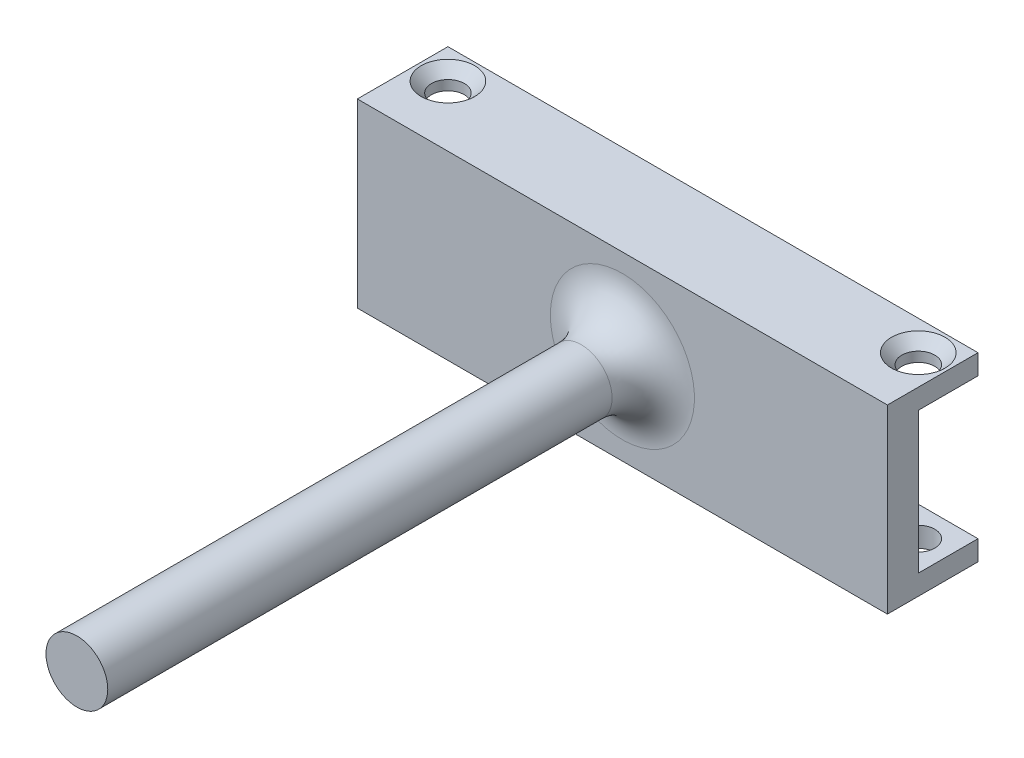
ISO-10303-21;
HEADER;
FILE_DESCRIPTION(('STEP AP214'),'2;1');
FILE_NAME('part.step','',(''),(''),'','','');
FILE_SCHEMA(('AUTOMOTIVE_DESIGN { 1 0 10303 214 1 1 1 1 }'));
ENDSEC;
DATA;
#1=APPLICATION_CONTEXT('core data for automotive mechanical design processes');
#2=APPLICATION_PROTOCOL_DEFINITION('international standard','automotive_design',2000,#1);
#3=PRODUCT_CONTEXT('',#1,'mechanical');
#4=PRODUCT('Part','Part','',(#3));
#5=PRODUCT_RELATED_PRODUCT_CATEGORY('part','',(#4));
#6=PRODUCT_DEFINITION_FORMATION('','',#4);
#7=PRODUCT_DEFINITION_CONTEXT('part definition',#1,'design');
#8=PRODUCT_DEFINITION('design','',#6,#7);
#9=PRODUCT_DEFINITION_SHAPE('','',#8);
#10=(LENGTH_UNIT() NAMED_UNIT(*) SI_UNIT(.MILLI.,.METRE.));
#11=(NAMED_UNIT(*) PLANE_ANGLE_UNIT() SI_UNIT($,.RADIAN.));
#12=(NAMED_UNIT(*) SI_UNIT($,.STERADIAN.) SOLID_ANGLE_UNIT());
#13=UNCERTAINTY_MEASURE_WITH_UNIT(LENGTH_MEASURE(1.E-05),#10,'distance_accuracy_value','');
#14=(GEOMETRIC_REPRESENTATION_CONTEXT(3) GLOBAL_UNCERTAINTY_ASSIGNED_CONTEXT((#13)) GLOBAL_UNIT_ASSIGNED_CONTEXT((#10,
#11,#12)) REPRESENTATION_CONTEXT('',''));
#15=CARTESIAN_POINT('',(0.,0.,0.));
#16=DIRECTION('',(0.,0.,1.));
#17=DIRECTION('',(1.,0.,0.));
#18=AXIS2_PLACEMENT_3D('',#15,#16,#17);
#19=CARTESIAN_POINT('',(0.,0.,0.));
#20=DIRECTION('',(0.,0.,-1.));
#21=DIRECTION('',(-1.,0.,0.));
#22=AXIS2_PLACEMENT_3D('',#19,#20,#21);
#23=PLANE('',#22);
#24=DIRECTION('',(1.,0.,0.));
#25=VECTOR('',#24,1.);
#26=CARTESIAN_POINT('',(51.5,15.65,0.));
#27=LINE('',#26,#25);
#28=CARTESIAN_POINT('',(0.,15.65,0.));
#29=VERTEX_POINT('',#28);
#30=CARTESIAN_POINT('',(51.5,15.65,0.));
#31=VERTEX_POINT('',#30);
#32=EDGE_CURVE('E131',#29,#31,#27,.T.);
#33=ORIENTED_EDGE('',*,*,#32,.F.);
#34=DIRECTION('',(0.,-1.,0.));
#35=VECTOR('',#34,1.);
#36=CARTESIAN_POINT('',(0.,0.,0.));
#37=LINE('',#36,#35);
#38=CARTESIAN_POINT('',(0.,17.6,0.));
#39=VERTEX_POINT('',#38);
#40=EDGE_CURVE('E151',#39,#29,#37,.T.);
#41=ORIENTED_EDGE('',*,*,#40,.F.);
#42=DIRECTION('',(-1.,0.,0.));
#43=VECTOR('',#42,1.);
#44=CARTESIAN_POINT('',(0.,17.6,0.));
#45=LINE('',#44,#43);
#46=CARTESIAN_POINT('',(51.5,17.6,0.));
#47=VERTEX_POINT('',#46);
#48=EDGE_CURVE('E86',#47,#39,#45,.T.);
#49=ORIENTED_EDGE('',*,*,#48,.F.);
#50=DIRECTION('',(0.,1.,0.));
#51=VECTOR('',#50,1.);
#52=CARTESIAN_POINT('',(51.5,0.,0.));
#53=LINE('',#52,#51);
#54=EDGE_CURVE('E157',#31,#47,#53,.T.);
#55=ORIENTED_EDGE('',*,*,#54,.F.);
#56=EDGE_LOOP('',(#33,#41,#49,#55));
#57=FACE_BOUND('',#56,.T.);
#58=ADVANCED_FACE('F41',(#57),#23,.T.);
#59=CARTESIAN_POINT('',(0.,0.,8.8));
#60=DIRECTION('',(1.,0.,0.));
#61=DIRECTION('',(0.,1.,0.));
#62=AXIS2_PLACEMENT_3D('',#59,#60,#61);
#63=PLANE('',#62);
#64=ORIENTED_EDGE('',*,*,#40,.T.);
#65=DIRECTION('',(0.,0.,-1.));
#66=VECTOR('',#65,1.);
#67=CARTESIAN_POINT('',(0.,15.65,5.8));
#68=LINE('',#67,#66);
#69=CARTESIAN_POINT('',(0.,15.65,5.8));
#70=VERTEX_POINT('',#69);
#71=EDGE_CURVE('E139',#70,#29,#68,.T.);
#72=ORIENTED_EDGE('',*,*,#71,.F.);
#73=DIRECTION('',(0.,1.,0.));
#74=VECTOR('',#73,1.);
#75=CARTESIAN_POINT('',(0.,1.95,5.8));
#76=LINE('',#75,#74);
#77=CARTESIAN_POINT('',(0.,1.95,5.8));
#78=VERTEX_POINT('',#77);
#79=EDGE_CURVE('E121',#78,#70,#76,.T.);
#80=ORIENTED_EDGE('',*,*,#79,.F.);
#81=DIRECTION('',(0.,0.,-1.));
#82=VECTOR('',#81,1.);
#83=CARTESIAN_POINT('',(0.,1.95,5.8));
#84=LINE('',#83,#82);
#85=CARTESIAN_POINT('',(0.,1.95,0.));
#86=VERTEX_POINT('',#85);
#87=EDGE_CURVE('E118',#78,#86,#84,.T.);
#88=ORIENTED_EDGE('',*,*,#87,.T.);
#89=CARTESIAN_POINT('',(0.,0.,0.));
#90=VERTEX_POINT('',#89);
#91=EDGE_CURVE('E155',#86,#90,#37,.T.);
#92=ORIENTED_EDGE('',*,*,#91,.T.);
#93=DIRECTION('',(0.,0.,-1.));
#94=VECTOR('',#93,1.);
#95=CARTESIAN_POINT('',(0.,0.,8.8));
#96=LINE('',#95,#94);
#97=CARTESIAN_POINT('',(0.,0.,8.8));
#98=VERTEX_POINT('',#97);
#99=EDGE_CURVE('E165',#98,#90,#96,.T.);
#100=ORIENTED_EDGE('',*,*,#99,.F.);
#101=DIRECTION('',(0.,-1.,0.));
#102=VECTOR('',#101,1.);
#103=CARTESIAN_POINT('',(0.,0.,8.8));
#104=LINE('',#103,#102);
#105=CARTESIAN_POINT('',(0.,17.6,8.8));
#106=VERTEX_POINT('',#105);
#107=EDGE_CURVE('E144',#106,#98,#104,.T.);
#108=ORIENTED_EDGE('',*,*,#107,.F.);
#109=DIRECTION('',(0.,0.,-1.));
#110=VECTOR('',#109,1.);
#111=CARTESIAN_POINT('',(0.,17.6,8.8));
#112=LINE('',#111,#110);
#113=EDGE_CURVE('E150',#106,#39,#112,.T.);
#114=ORIENTED_EDGE('',*,*,#113,.T.);
#115=EDGE_LOOP('',(#64,#72,#80,#88,#92,#100,#108,#114));
#116=FACE_BOUND('',#115,.T.);
#117=ADVANCED_FACE('F204',(#116),#63,.F.);
#118=CARTESIAN_POINT('',(0.,0.,8.8));
#119=DIRECTION('',(0.,1.,0.));
#120=DIRECTION('',(0.,0.,1.));
#121=AXIS2_PLACEMENT_3D('',#118,#119,#120);
#122=PLANE('',#121);
#123=CARTESIAN_POINT('',(2.90000000000001,0.,2.9));
#124=DIRECTION('',(0.,1.,0.));
#125=DIRECTION('',(0.,0.,1.));
#126=AXIS2_PLACEMENT_3D('',#123,#124,#125);
#127=CIRCLE('',#126,1.6);
#128=CARTESIAN_POINT('',(2.90000000000001,0.,4.5));
#129=VERTEX_POINT('',#128);
#130=EDGE_CURVE('E232',#129,#129,#127,.T.);
#131=ORIENTED_EDGE('',*,*,#130,.T.);
#132=EDGE_LOOP('',(#131));
#133=FACE_BOUND('',#132,.T.);
#134=CARTESIAN_POINT('',(48.6,0.,2.9));
#135=DIRECTION('',(0.,1.,0.));
#136=DIRECTION('',(0.,0.,1.));
#137=AXIS2_PLACEMENT_3D('',#134,#135,#136);
#138=CIRCLE('',#137,1.6);
#139=CARTESIAN_POINT('',(48.6,0.,4.5));
#140=VERTEX_POINT('',#139);
#141=EDGE_CURVE('E177',#140,#140,#138,.T.);
#142=ORIENTED_EDGE('',*,*,#141,.T.);
#143=EDGE_LOOP('',(#142));
#144=FACE_BOUND('',#143,.T.);
#145=DIRECTION('',(1.,0.,0.));
#146=VECTOR('',#145,1.);
#147=CARTESIAN_POINT('',(0.,0.,0.));
#148=LINE('',#147,#146);
#149=CARTESIAN_POINT('',(51.5,0.,0.));
#150=VERTEX_POINT('',#149);
#151=EDGE_CURVE('E154',#90,#150,#148,.T.);
#152=ORIENTED_EDGE('',*,*,#151,.T.);
#153=DIRECTION('',(0.,0.,-1.));
#154=VECTOR('',#153,1.);
#155=CARTESIAN_POINT('',(51.5,0.,8.8));
#156=LINE('',#155,#154);
#157=CARTESIAN_POINT('',(51.5,0.,8.8));
#158=VERTEX_POINT('',#157);
#159=EDGE_CURVE('E163',#158,#150,#156,.T.);
#160=ORIENTED_EDGE('',*,*,#159,.F.);
#161=DIRECTION('',(1.,0.,0.));
#162=VECTOR('',#161,1.);
#163=CARTESIAN_POINT('',(0.,0.,8.8));
#164=LINE('',#163,#162);
#165=EDGE_CURVE('E94',#98,#158,#164,.T.);
#166=ORIENTED_EDGE('',*,*,#165,.F.);
#167=ORIENTED_EDGE('',*,*,#99,.T.);
#168=EDGE_LOOP('',(#152,#160,#166,#167));
#169=FACE_BOUND('',#168,.T.);
#170=ADVANCED_FACE('F211',(#133,#144,#169),#122,.F.);
#171=CARTESIAN_POINT('',(51.5,0.,8.8));
#172=DIRECTION('',(-1.,0.,0.));
#173=DIRECTION('',(0.,-1.,0.));
#174=AXIS2_PLACEMENT_3D('',#171,#172,#173);
#175=PLANE('',#174);
#176=DIRECTION('',(0.,-1.,0.));
#177=VECTOR('',#176,1.);
#178=CARTESIAN_POINT('',(51.5,1.95,5.8));
#179=LINE('',#178,#177);
#180=CARTESIAN_POINT('',(51.5,15.65,5.8));
#181=VERTEX_POINT('',#180);
#182=CARTESIAN_POINT('',(51.5,1.95,5.8));
#183=VERTEX_POINT('',#182);
#184=EDGE_CURVE('E122',#181,#183,#179,.T.);
#185=ORIENTED_EDGE('',*,*,#184,.F.);
#186=DIRECTION('',(0.,0.,-1.));
#187=VECTOR('',#186,1.);
#188=CARTESIAN_POINT('',(51.5,15.65,5.8));
#189=LINE('',#188,#187);
#190=EDGE_CURVE('E239',#181,#31,#189,.T.);
#191=ORIENTED_EDGE('',*,*,#190,.T.);
#192=ORIENTED_EDGE('',*,*,#54,.T.);
#193=DIRECTION('',(0.,0.,-1.));
#194=VECTOR('',#193,1.);
#195=CARTESIAN_POINT('',(51.5,17.6,8.8));
#196=LINE('',#195,#194);
#197=CARTESIAN_POINT('',(51.5,17.6,8.8));
#198=VERTEX_POINT('',#197);
#199=EDGE_CURVE('E161',#198,#47,#196,.T.);
#200=ORIENTED_EDGE('',*,*,#199,.F.);
#201=DIRECTION('',(0.,1.,0.));
#202=VECTOR('',#201,1.);
#203=CARTESIAN_POINT('',(51.5,0.,8.8));
#204=LINE('',#203,#202);
#205=EDGE_CURVE('E147',#158,#198,#204,.T.);
#206=ORIENTED_EDGE('',*,*,#205,.F.);
#207=ORIENTED_EDGE('',*,*,#159,.T.);
#208=CARTESIAN_POINT('',(51.5,1.95,0.));
#209=VERTEX_POINT('',#208);
#210=EDGE_CURVE('E137',#150,#209,#53,.T.);
#211=ORIENTED_EDGE('',*,*,#210,.T.);
#212=DIRECTION('',(0.,0.,-1.));
#213=VECTOR('',#212,1.);
#214=CARTESIAN_POINT('',(51.5,1.95,5.8));
#215=LINE('',#214,#213);
#216=EDGE_CURVE('E56',#183,#209,#215,.T.);
#217=ORIENTED_EDGE('',*,*,#216,.F.);
#218=EDGE_LOOP('',(#185,#191,#192,#200,#206,#207,#211,#217));
#219=FACE_BOUND('',#218,.T.);
#220=ADVANCED_FACE('F134',(#219),#175,.F.);
#221=CARTESIAN_POINT('',(0.,17.6,8.8));
#222=DIRECTION('',(0.,-1.,0.));
#223=DIRECTION('',(0.,0.,-1.));
#224=AXIS2_PLACEMENT_3D('',#221,#222,#223);
#225=PLANE('',#224);
#226=CARTESIAN_POINT('',(48.6,17.6,2.9));
#227=DIRECTION('',(0.,-1.,0.));
#228=DIRECTION('',(0.,0.,-1.));
#229=AXIS2_PLACEMENT_3D('',#226,#227,#228);
#230=CIRCLE('',#229,2.6);
#231=CARTESIAN_POINT('',(48.6,17.6,0.299999999999995));
#232=VERTEX_POINT('',#231);
#233=EDGE_CURVE('E183',#232,#232,#230,.T.);
#234=ORIENTED_EDGE('',*,*,#233,.T.);
#235=EDGE_LOOP('',(#234));
#236=FACE_BOUND('',#235,.T.);
#237=CARTESIAN_POINT('',(2.90000000000001,17.6,2.9));
#238=DIRECTION('',(0.,-1.,0.));
#239=DIRECTION('',(0.,0.,-1.));
#240=AXIS2_PLACEMENT_3D('',#237,#238,#239);
#241=CIRCLE('',#240,2.6);
#242=CARTESIAN_POINT('',(2.90000000000001,17.6,0.300000000000002));
#243=VERTEX_POINT('',#242);
#244=EDGE_CURVE('E180',#243,#243,#241,.T.);
#245=ORIENTED_EDGE('',*,*,#244,.T.);
#246=EDGE_LOOP('',(#245));
#247=FACE_BOUND('',#246,.T.);
#248=ORIENTED_EDGE('',*,*,#48,.T.);
#249=ORIENTED_EDGE('',*,*,#113,.F.);
#250=DIRECTION('',(-1.,0.,0.));
#251=VECTOR('',#250,1.);
#252=CARTESIAN_POINT('',(0.,17.6,8.8));
#253=LINE('',#252,#251);
#254=EDGE_CURVE('E65',#198,#106,#253,.T.);
#255=ORIENTED_EDGE('',*,*,#254,.F.);
#256=ORIENTED_EDGE('',*,*,#199,.T.);
#257=EDGE_LOOP('',(#248,#249,#255,#256));
#258=FACE_BOUND('',#257,.T.);
#259=ADVANCED_FACE('F227',(#236,#247,#258),#225,.F.);
#260=CARTESIAN_POINT('',(0.,0.,8.8));
#261=DIRECTION('',(0.,0.,-1.));
#262=DIRECTION('',(-1.,0.,0.));
#263=AXIS2_PLACEMENT_3D('',#260,#261,#262);
#264=PLANE('',#263);
#265=CARTESIAN_POINT('',(25.75,8.8,8.8));
#266=DIRECTION('',(0.,0.,-1.));
#267=DIRECTION('',(-1.,0.,0.));
#268=AXIS2_PLACEMENT_3D('',#265,#266,#267);
#269=CIRCLE('',#268,7.);
#270=CARTESIAN_POINT('',(18.75,8.8,8.8));
#271=VERTEX_POINT('',#270);
#272=EDGE_CURVE('E11',#271,#271,#269,.T.);
#273=ORIENTED_EDGE('',*,*,#272,.T.);
#274=EDGE_LOOP('',(#273));
#275=FACE_BOUND('',#274,.T.);
#276=ORIENTED_EDGE('',*,*,#107,.T.);
#277=ORIENTED_EDGE('',*,*,#165,.T.);
#278=ORIENTED_EDGE('',*,*,#205,.T.);
#279=ORIENTED_EDGE('',*,*,#254,.T.);
#280=EDGE_LOOP('',(#276,#277,#278,#279));
#281=FACE_BOUND('',#280,.T.);
#282=ADVANCED_FACE('F219',(#275,#281),#264,.F.);
#283=DIRECTION('',(-1.,0.,0.));
#284=VECTOR('',#283,1.);
#285=CARTESIAN_POINT('',(51.5,1.95,0.));
#286=LINE('',#285,#284);
#287=EDGE_CURVE('E230',#209,#86,#286,.T.);
#288=ORIENTED_EDGE('',*,*,#287,.F.);
#289=ORIENTED_EDGE('',*,*,#210,.F.);
#290=ORIENTED_EDGE('',*,*,#151,.F.);
#291=ORIENTED_EDGE('',*,*,#91,.F.);
#292=EDGE_LOOP('',(#288,#289,#290,#291));
#293=FACE_BOUND('',#292,.T.);
#294=ADVANCED_FACE('F207',(#293),#23,.T.);
#295=CARTESIAN_POINT('',(51.5,15.65,5.8));
#296=DIRECTION('',(0.,1.,0.));
#297=DIRECTION('',(0.,0.,1.));
#298=AXIS2_PLACEMENT_3D('',#295,#296,#297);
#299=PLANE('',#298);
#300=CARTESIAN_POINT('',(2.90000000000001,15.65,2.9));
#301=DIRECTION('',(0.,1.,0.));
#302=DIRECTION('',(0.,0.,1.));
#303=AXIS2_PLACEMENT_3D('',#300,#301,#302);
#304=CIRCLE('',#303,1.6);
#305=CARTESIAN_POINT('',(2.90000000000001,15.65,4.5));
#306=VERTEX_POINT('',#305);
#307=EDGE_CURVE('E176',#306,#306,#304,.T.);
#308=ORIENTED_EDGE('',*,*,#307,.T.);
#309=EDGE_LOOP('',(#308));
#310=FACE_BOUND('',#309,.T.);
#311=CARTESIAN_POINT('',(48.6,15.65,2.9));
#312=DIRECTION('',(0.,1.,0.));
#313=DIRECTION('',(0.,0.,1.));
#314=AXIS2_PLACEMENT_3D('',#311,#312,#313);
#315=CIRCLE('',#314,1.6);
#316=CARTESIAN_POINT('',(48.6,15.65,4.5));
#317=VERTEX_POINT('',#316);
#318=EDGE_CURVE('E171',#317,#317,#315,.T.);
#319=ORIENTED_EDGE('',*,*,#318,.T.);
#320=EDGE_LOOP('',(#319));
#321=FACE_BOUND('',#320,.T.);
#322=ORIENTED_EDGE('',*,*,#32,.T.);
#323=ORIENTED_EDGE('',*,*,#190,.F.);
#324=DIRECTION('',(1.,0.,0.));
#325=VECTOR('',#324,1.);
#326=CARTESIAN_POINT('',(51.5,15.65,5.8));
#327=LINE('',#326,#325);
#328=EDGE_CURVE('E128',#70,#181,#327,.T.);
#329=ORIENTED_EDGE('',*,*,#328,.F.);
#330=ORIENTED_EDGE('',*,*,#71,.T.);
#331=EDGE_LOOP('',(#322,#323,#329,#330));
#332=FACE_BOUND('',#331,.T.);
#333=ADVANCED_FACE('F218',(#310,#321,#332),#299,.F.);
#334=CARTESIAN_POINT('',(51.5,1.95,5.8));
#335=DIRECTION('',(0.,-1.,0.));
#336=DIRECTION('',(0.,0.,-1.));
#337=AXIS2_PLACEMENT_3D('',#334,#335,#336);
#338=PLANE('',#337);
#339=CARTESIAN_POINT('',(2.90000000000001,1.95,2.9));
#340=DIRECTION('',(0.,-1.,0.));
#341=DIRECTION('',(0.,0.,-1.));
#342=AXIS2_PLACEMENT_3D('',#339,#340,#341);
#343=CIRCLE('',#342,1.6);
#344=CARTESIAN_POINT('',(2.90000000000001,1.95,1.3));
#345=VERTEX_POINT('',#344);
#346=EDGE_CURVE('E173',#345,#345,#343,.T.);
#347=ORIENTED_EDGE('',*,*,#346,.T.);
#348=EDGE_LOOP('',(#347));
#349=FACE_BOUND('',#348,.T.);
#350=CARTESIAN_POINT('',(48.6,1.95,2.9));
#351=DIRECTION('',(0.,-1.,0.));
#352=DIRECTION('',(0.,0.,-1.));
#353=AXIS2_PLACEMENT_3D('',#350,#351,#352);
#354=CIRCLE('',#353,1.6);
#355=CARTESIAN_POINT('',(48.6,1.95,1.3));
#356=VERTEX_POINT('',#355);
#357=EDGE_CURVE('E168',#356,#356,#354,.T.);
#358=ORIENTED_EDGE('',*,*,#357,.T.);
#359=EDGE_LOOP('',(#358));
#360=FACE_BOUND('',#359,.T.);
#361=ORIENTED_EDGE('',*,*,#287,.T.);
#362=ORIENTED_EDGE('',*,*,#87,.F.);
#363=DIRECTION('',(-1.,0.,0.));
#364=VECTOR('',#363,1.);
#365=CARTESIAN_POINT('',(51.5,1.95,5.8));
#366=LINE('',#365,#364);
#367=EDGE_CURVE('E114',#183,#78,#366,.T.);
#368=ORIENTED_EDGE('',*,*,#367,.F.);
#369=ORIENTED_EDGE('',*,*,#216,.T.);
#370=EDGE_LOOP('',(#361,#362,#368,#369));
#371=FACE_BOUND('',#370,.T.);
#372=ADVANCED_FACE('F116',(#349,#360,#371),#338,.F.);
#373=CARTESIAN_POINT('',(0.,0.,5.8));
#374=DIRECTION('',(0.,0.,1.));
#375=DIRECTION('',(1.,0.,0.));
#376=AXIS2_PLACEMENT_3D('',#373,#374,#375);
#377=PLANE('',#376);
#378=ORIENTED_EDGE('',*,*,#184,.T.);
#379=ORIENTED_EDGE('',*,*,#367,.T.);
#380=ORIENTED_EDGE('',*,*,#79,.T.);
#381=ORIENTED_EDGE('',*,*,#328,.T.);
#382=EDGE_LOOP('',(#378,#379,#380,#381));
#383=FACE_BOUND('',#382,.T.);
#384=ADVANCED_FACE('F126',(#383),#377,.F.);
#385=CARTESIAN_POINT('',(48.6,-0.200000000000006,2.9));
#386=DIRECTION('',(0.,1.,0.));
#387=DIRECTION('',(0.,0.,1.));
#388=AXIS2_PLACEMENT_3D('',#385,#386,#387);
#389=CYLINDRICAL_SURFACE('',#388,1.6);
#390=ORIENTED_EDGE('',*,*,#357,.F.);
#391=EDGE_LOOP('',(#390));
#392=FACE_BOUND('',#391,.T.);
#393=ORIENTED_EDGE('',*,*,#141,.F.);
#394=EDGE_LOOP('',(#393));
#395=FACE_BOUND('',#394,.T.);
#396=ADVANCED_FACE('F270',(#392,#395),#389,.F.);
#397=CARTESIAN_POINT('',(2.90000000000001,-0.200000000000006,2.9));
#398=DIRECTION('',(0.,1.,0.));
#399=DIRECTION('',(0.,0.,1.));
#400=AXIS2_PLACEMENT_3D('',#397,#398,#399);
#401=CYLINDRICAL_SURFACE('',#400,1.6);
#402=ORIENTED_EDGE('',*,*,#346,.F.);
#403=EDGE_LOOP('',(#402));
#404=FACE_BOUND('',#403,.T.);
#405=ORIENTED_EDGE('',*,*,#130,.F.);
#406=EDGE_LOOP('',(#405));
#407=FACE_BOUND('',#406,.T.);
#408=ADVANCED_FACE('F266',(#404,#407),#401,.F.);
#409=CARTESIAN_POINT('',(48.6,16.6,2.9));
#410=DIRECTION('',(0.,-1.,0.));
#411=DIRECTION('',(0.,0.,-1.));
#412=AXIS2_PLACEMENT_3D('',#409,#410,#411);
#413=CIRCLE('',#412,1.6);
#414=CARTESIAN_POINT('',(48.6,16.6,1.3));
#415=VERTEX_POINT('',#414);
#416=EDGE_CURVE('E167',#415,#415,#413,.F.);
#417=ORIENTED_EDGE('',*,*,#416,.T.);
#418=EDGE_LOOP('',(#417));
#419=FACE_BOUND('',#418,.T.);
#420=ORIENTED_EDGE('',*,*,#318,.F.);
#421=EDGE_LOOP('',(#420));
#422=FACE_BOUND('',#421,.T.);
#423=ADVANCED_FACE('F269',(#419,#422),#389,.F.);
#424=CARTESIAN_POINT('',(2.90000000000001,16.6,2.9));
#425=DIRECTION('',(0.,-1.,0.));
#426=DIRECTION('',(0.,0.,-1.));
#427=AXIS2_PLACEMENT_3D('',#424,#425,#426);
#428=CIRCLE('',#427,1.6);
#429=CARTESIAN_POINT('',(2.90000000000001,16.6,1.3));
#430=VERTEX_POINT('',#429);
#431=EDGE_CURVE('E186',#430,#430,#428,.F.);
#432=ORIENTED_EDGE('',*,*,#431,.T.);
#433=EDGE_LOOP('',(#432));
#434=FACE_BOUND('',#433,.T.);
#435=ORIENTED_EDGE('',*,*,#307,.F.);
#436=EDGE_LOOP('',(#435));
#437=FACE_BOUND('',#436,.T.);
#438=ADVANCED_FACE('F272',(#434,#437),#401,.F.);
#439=CARTESIAN_POINT('',(48.6,16.6,2.9));
#440=DIRECTION('',(0.,1.,0.));
#441=DIRECTION('',(0.,0.,1.));
#442=AXIS2_PLACEMENT_3D('',#439,#440,#441);
#443=CONICAL_SURFACE('',#442,1.6,0.785398163397453);
#444=ORIENTED_EDGE('',*,*,#233,.F.);
#445=EDGE_LOOP('',(#444));
#446=FACE_BOUND('',#445,.T.);
#447=ORIENTED_EDGE('',*,*,#416,.F.);
#448=EDGE_LOOP('',(#447));
#449=FACE_BOUND('',#448,.T.);
#450=ADVANCED_FACE('F263',(#446,#449),#443,.F.);
#451=CARTESIAN_POINT('',(2.90000000000001,16.6,2.9));
#452=DIRECTION('',(0.,1.,0.));
#453=DIRECTION('',(0.,0.,1.));
#454=AXIS2_PLACEMENT_3D('',#451,#452,#453);
#455=CONICAL_SURFACE('',#454,1.6,0.785398163397449);
#456=ORIENTED_EDGE('',*,*,#244,.F.);
#457=EDGE_LOOP('',(#456));
#458=FACE_BOUND('',#457,.T.);
#459=ORIENTED_EDGE('',*,*,#431,.F.);
#460=EDGE_LOOP('',(#459));
#461=FACE_BOUND('',#460,.T.);
#462=ADVANCED_FACE('F258',(#458,#461),#455,.F.);
#463=CARTESIAN_POINT('',(25.75,8.8,61.8));
#464=DIRECTION('',(0.,0.,-1.));
#465=DIRECTION('',(-1.,0.,0.));
#466=AXIS2_PLACEMENT_3D('',#463,#464,#465);
#467=CYLINDRICAL_SURFACE('',#466,3.);
#468=CARTESIAN_POINT('',(25.75,8.8,12.8));
#469=DIRECTION('',(0.,0.,-1.));
#470=DIRECTION('',(-1.,0.,0.));
#471=AXIS2_PLACEMENT_3D('',#468,#469,#470);
#472=CIRCLE('',#471,3.);
#473=CARTESIAN_POINT('',(22.75,8.8,12.8));
#474=VERTEX_POINT('',#473);
#475=EDGE_CURVE('E49',#474,#474,#472,.F.);
#476=ORIENTED_EDGE('',*,*,#475,.T.);
#477=EDGE_LOOP('',(#476));
#478=FACE_BOUND('',#477,.T.);
#479=CARTESIAN_POINT('',(25.75,8.8,61.8));
#480=DIRECTION('',(0.,0.,1.));
#481=DIRECTION('',(1.,0.,0.));
#482=AXIS2_PLACEMENT_3D('',#479,#480,#481);
#483=CIRCLE('',#482,3.);
#484=CARTESIAN_POINT('',(28.75,8.8,61.8));
#485=VERTEX_POINT('',#484);
#486=EDGE_CURVE('E172',#485,#485,#483,.T.);
#487=ORIENTED_EDGE('',*,*,#486,.F.);
#488=EDGE_LOOP('',(#487));
#489=FACE_BOUND('',#488,.T.);
#490=ADVANCED_FACE('F191',(#478,#489),#467,.T.);
#491=CARTESIAN_POINT('',(25.75,8.8,61.8));
#492=DIRECTION('',(0.,0.,1.));
#493=DIRECTION('',(1.,0.,0.));
#494=AXIS2_PLACEMENT_3D('',#491,#492,#493);
#495=PLANE('',#494);
#496=ORIENTED_EDGE('',*,*,#486,.T.);
#497=EDGE_LOOP('',(#496));
#498=FACE_BOUND('',#497,.T.);
#499=ADVANCED_FACE('F195',(#498),#495,.T.);
#500=CARTESIAN_POINT('',(25.75,8.8,12.8));
#501=DIRECTION('',(0.,0.,-1.));
#502=DIRECTION('',(-1.,0.,0.));
#503=AXIS2_PLACEMENT_3D('',#500,#501,#502);
#504=TOROIDAL_SURFACE('',#503,7.,4.);
#505=ORIENTED_EDGE('',*,*,#272,.F.);
#506=EDGE_LOOP('',(#505));
#507=FACE_BOUND('',#506,.T.);
#508=ORIENTED_EDGE('',*,*,#475,.F.);
#509=EDGE_LOOP('',(#508));
#510=FACE_BOUND('',#509,.T.);
#511=ADVANCED_FACE('F43',(#507,#510),#504,.F.);
#512=CLOSED_SHELL('',(#58,#117,#170,#220,#259,#282,#294,#333,#372,#384,#396,#408,#423,#438,#450,
#462,#490,#499,#511));
#513=MANIFOLD_SOLID_BREP('B2',#512);
#514=ADVANCED_BREP_SHAPE_REPRESENTATION('',(#18,#513),#14);
#515=SHAPE_DEFINITION_REPRESENTATION(#9,#514);
ENDSEC;
END-ISO-10303-21;
